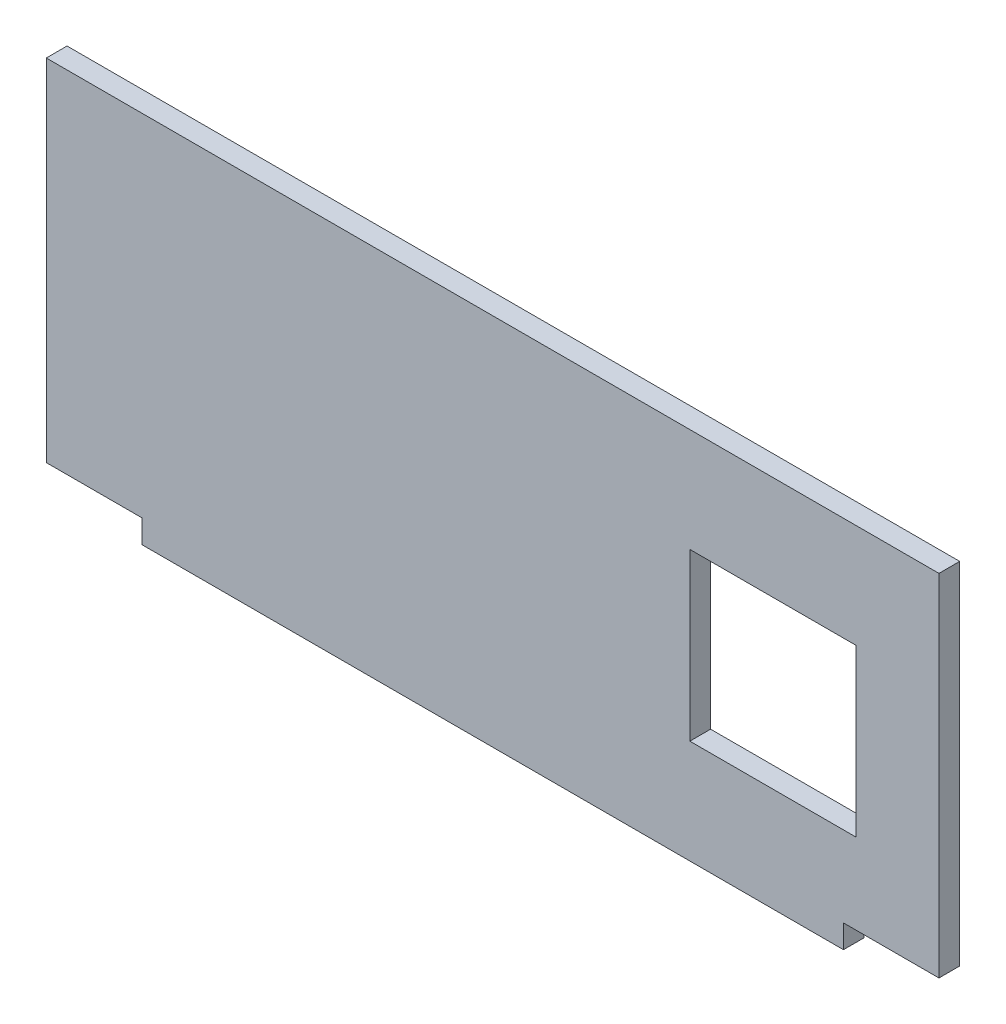
ISO-10303-21;
HEADER;
FILE_DESCRIPTION(('STEP AP214'),'2;1');
FILE_NAME('part.step','',(''),(''),'','','');
FILE_SCHEMA(('AUTOMOTIVE_DESIGN { 1 0 10303 214 1 1 1 1 }'));
ENDSEC;
DATA;
#1=APPLICATION_CONTEXT('core data for automotive mechanical design processes');
#2=APPLICATION_PROTOCOL_DEFINITION('international standard','automotive_design',2000,#1);
#3=PRODUCT_CONTEXT('',#1,'mechanical');
#4=PRODUCT('Part','Part','',(#3));
#5=PRODUCT_RELATED_PRODUCT_CATEGORY('part','',(#4));
#6=PRODUCT_DEFINITION_FORMATION('','',#4);
#7=PRODUCT_DEFINITION_CONTEXT('part definition',#1,'design');
#8=PRODUCT_DEFINITION('design','',#6,#7);
#9=PRODUCT_DEFINITION_SHAPE('','',#8);
#10=(LENGTH_UNIT() NAMED_UNIT(*) SI_UNIT(.MILLI.,.METRE.));
#11=(NAMED_UNIT(*) PLANE_ANGLE_UNIT() SI_UNIT($,.RADIAN.));
#12=(NAMED_UNIT(*) SI_UNIT($,.STERADIAN.) SOLID_ANGLE_UNIT());
#13=UNCERTAINTY_MEASURE_WITH_UNIT(LENGTH_MEASURE(1.E-05),#10,'distance_accuracy_value','');
#14=(GEOMETRIC_REPRESENTATION_CONTEXT(3) GLOBAL_UNCERTAINTY_ASSIGNED_CONTEXT((#13)) GLOBAL_UNIT_ASSIGNED_CONTEXT((#10,
#11,#12)) REPRESENTATION_CONTEXT('',''));
#15=CARTESIAN_POINT('',(0.,0.,0.));
#16=DIRECTION('',(0.,0.,1.));
#17=DIRECTION('',(1.,0.,0.));
#18=AXIS2_PLACEMENT_3D('',#15,#16,#17);
#19=CARTESIAN_POINT('',(0.,0.,10.));
#20=DIRECTION('',(-1.,0.,0.));
#21=DIRECTION('',(0.,-1.,0.));
#22=AXIS2_PLACEMENT_3D('',#19,#20,#21);
#23=PLANE('',#22);
#24=DIRECTION('',(0.,1.,0.));
#25=VECTOR('',#24,1.);
#26=CARTESIAN_POINT('',(0.,0.,10.));
#27=LINE('',#26,#25);
#28=CARTESIAN_POINT('',(0.,11.2,10.));
#29=VERTEX_POINT('',#28);
#30=CARTESIAN_POINT('',(0.,180.,10.));
#31=VERTEX_POINT('',#30);
#32=EDGE_CURVE('E143',#29,#31,#27,.T.);
#33=ORIENTED_EDGE('',*,*,#32,.F.);
#34=DIRECTION('',(0.,0.,1.));
#35=VECTOR('',#34,1.);
#36=CARTESIAN_POINT('',(0.,11.2,0.));
#37=LINE('',#36,#35);
#38=CARTESIAN_POINT('',(0.,11.2,0.));
#39=VERTEX_POINT('',#38);
#40=EDGE_CURVE('E217',#39,#29,#37,.T.);
#41=ORIENTED_EDGE('',*,*,#40,.F.);
#42=DIRECTION('',(0.,1.,0.));
#43=VECTOR('',#42,1.);
#44=CARTESIAN_POINT('',(0.,0.,0.));
#45=LINE('',#44,#43);
#46=CARTESIAN_POINT('',(0.,180.,0.));
#47=VERTEX_POINT('',#46);
#48=EDGE_CURVE('E166',#39,#47,#45,.T.);
#49=ORIENTED_EDGE('',*,*,#48,.T.);
#50=DIRECTION('',(0.,0.,-1.));
#51=VECTOR('',#50,1.);
#52=CARTESIAN_POINT('',(0.,180.,10.));
#53=LINE('',#52,#51);
#54=EDGE_CURVE('E11',#31,#47,#53,.T.);
#55=ORIENTED_EDGE('',*,*,#54,.F.);
#56=EDGE_LOOP('',(#33,#41,#49,#55));
#57=FACE_BOUND('',#56,.T.);
#58=ADVANCED_FACE('F35',(#57),#23,.F.);
#59=CARTESIAN_POINT('',(0.,180.,10.));
#60=DIRECTION('',(0.,-1.,0.));
#61=DIRECTION('',(1.,0.,0.));
#62=AXIS2_PLACEMENT_3D('',#59,#60,#61);
#63=PLANE('',#62);
#64=DIRECTION('',(-1.,0.,0.));
#65=VECTOR('',#64,1.);
#66=CARTESIAN_POINT('',(0.,180.,0.));
#67=LINE('',#66,#65);
#68=CARTESIAN_POINT('',(-430.,180.,0.));
#69=VERTEX_POINT('',#68);
#70=EDGE_CURVE('E149',#47,#69,#67,.T.);
#71=ORIENTED_EDGE('',*,*,#70,.T.);
#72=DIRECTION('',(0.,0.,-1.));
#73=VECTOR('',#72,1.);
#74=CARTESIAN_POINT('',(-430.,180.,10.));
#75=LINE('',#74,#73);
#76=CARTESIAN_POINT('',(-430.,180.,10.));
#77=VERTEX_POINT('',#76);
#78=EDGE_CURVE('E42',#77,#69,#75,.T.);
#79=ORIENTED_EDGE('',*,*,#78,.F.);
#80=DIRECTION('',(-1.,0.,0.));
#81=VECTOR('',#80,1.);
#82=CARTESIAN_POINT('',(0.,180.,10.));
#83=LINE('',#82,#81);
#84=EDGE_CURVE('E146',#31,#77,#83,.T.);
#85=ORIENTED_EDGE('',*,*,#84,.F.);
#86=ORIENTED_EDGE('',*,*,#54,.T.);
#87=EDGE_LOOP('',(#71,#79,#85,#86));
#88=FACE_BOUND('',#87,.T.);
#89=ADVANCED_FACE('F170',(#88),#63,.F.);
#90=CARTESIAN_POINT('',(-430.,0.,10.));
#91=DIRECTION('',(1.,0.,0.));
#92=DIRECTION('',(0.,0.,-1.));
#93=AXIS2_PLACEMENT_3D('',#90,#91,#92);
#94=PLANE('',#93);
#95=DIRECTION('',(0.,-1.,0.));
#96=VECTOR('',#95,1.);
#97=CARTESIAN_POINT('',(-430.,0.,0.));
#98=LINE('',#97,#96);
#99=CARTESIAN_POINT('',(-430.,11.2,0.));
#100=VERTEX_POINT('',#99);
#101=EDGE_CURVE('E144',#69,#100,#98,.T.);
#102=ORIENTED_EDGE('',*,*,#101,.T.);
#103=DIRECTION('',(0.,0.,1.));
#104=VECTOR('',#103,1.);
#105=CARTESIAN_POINT('',(-430.,11.2,0.));
#106=LINE('',#105,#104);
#107=CARTESIAN_POINT('',(-430.,11.2,10.));
#108=VERTEX_POINT('',#107);
#109=EDGE_CURVE('E176',#100,#108,#106,.T.);
#110=ORIENTED_EDGE('',*,*,#109,.T.);
#111=DIRECTION('',(0.,-1.,0.));
#112=VECTOR('',#111,1.);
#113=CARTESIAN_POINT('',(-430.,0.,10.));
#114=LINE('',#113,#112);
#115=EDGE_CURVE('E157',#77,#108,#114,.T.);
#116=ORIENTED_EDGE('',*,*,#115,.F.);
#117=ORIENTED_EDGE('',*,*,#78,.T.);
#118=EDGE_LOOP('',(#102,#110,#116,#117));
#119=FACE_BOUND('',#118,.T.);
#120=ADVANCED_FACE('F175',(#119),#94,.F.);
#121=CARTESIAN_POINT('',(0.,0.,10.));
#122=DIRECTION('',(0.,1.,0.));
#123=DIRECTION('',(0.,0.,1.));
#124=AXIS2_PLACEMENT_3D('',#121,#122,#123);
#125=PLANE('',#124);
#126=DIRECTION('',(1.,0.,0.));
#127=VECTOR('',#126,1.);
#128=CARTESIAN_POINT('',(0.,0.,10.));
#129=LINE('',#128,#127);
#130=CARTESIAN_POINT('',(-384.,0.,10.));
#131=VERTEX_POINT('',#130);
#132=CARTESIAN_POINT('',(-46.,0.,10.));
#133=VERTEX_POINT('',#132);
#134=EDGE_CURVE('E139',#131,#133,#129,.T.);
#135=ORIENTED_EDGE('',*,*,#134,.F.);
#136=DIRECTION('',(0.,0.,1.));
#137=VECTOR('',#136,1.);
#138=CARTESIAN_POINT('',(-384.,0.,0.));
#139=LINE('',#138,#137);
#140=CARTESIAN_POINT('',(-384.,0.,0.));
#141=VERTEX_POINT('',#140);
#142=EDGE_CURVE('E127',#141,#131,#139,.T.);
#143=ORIENTED_EDGE('',*,*,#142,.F.);
#144=DIRECTION('',(1.,0.,0.));
#145=VECTOR('',#144,1.);
#146=CARTESIAN_POINT('',(0.,0.,0.));
#147=LINE('',#146,#145);
#148=CARTESIAN_POINT('',(-46.,0.,0.));
#149=VERTEX_POINT('',#148);
#150=EDGE_CURVE('E138',#141,#149,#147,.T.);
#151=ORIENTED_EDGE('',*,*,#150,.T.);
#152=DIRECTION('',(0.,0.,1.));
#153=VECTOR('',#152,1.);
#154=CARTESIAN_POINT('',(-46.,0.,0.));
#155=LINE('',#154,#153);
#156=EDGE_CURVE('E206',#149,#133,#155,.T.);
#157=ORIENTED_EDGE('',*,*,#156,.T.);
#158=EDGE_LOOP('',(#135,#143,#151,#157));
#159=FACE_BOUND('',#158,.T.);
#160=ADVANCED_FACE('F136',(#159),#125,.F.);
#161=CARTESIAN_POINT('',(0.,0.,10.));
#162=DIRECTION('',(0.,0.,1.));
#163=DIRECTION('',(1.,0.,0.));
#164=AXIS2_PLACEMENT_3D('',#161,#162,#163);
#165=PLANE('',#164);
#166=DIRECTION('',(-1.,0.,0.));
#167=VECTOR('',#166,1.);
#168=CARTESIAN_POINT('',(-430.,11.2,10.));
#169=LINE('',#168,#167);
#170=CARTESIAN_POINT('',(-384.,11.2,10.));
#171=VERTEX_POINT('',#170);
#172=EDGE_CURVE('E132',#171,#108,#169,.T.);
#173=ORIENTED_EDGE('',*,*,#172,.F.);
#174=DIRECTION('',(0.,1.,0.));
#175=VECTOR('',#174,1.);
#176=CARTESIAN_POINT('',(-384.,0.,10.));
#177=LINE('',#176,#175);
#178=EDGE_CURVE('E231',#131,#171,#177,.T.);
#179=ORIENTED_EDGE('',*,*,#178,.F.);
#180=ORIENTED_EDGE('',*,*,#134,.T.);
#181=DIRECTION('',(0.,-1.,0.));
#182=VECTOR('',#181,1.);
#183=CARTESIAN_POINT('',(-46.,0.,10.));
#184=LINE('',#183,#182);
#185=CARTESIAN_POINT('',(-46.,11.2,10.));
#186=VERTEX_POINT('',#185);
#187=EDGE_CURVE('E222',#186,#133,#184,.T.);
#188=ORIENTED_EDGE('',*,*,#187,.F.);
#189=DIRECTION('',(-1.,0.,0.));
#190=VECTOR('',#189,1.);
#191=CARTESIAN_POINT('',(0.,11.2,10.));
#192=LINE('',#191,#190);
#193=EDGE_CURVE('E177',#29,#186,#192,.T.);
#194=ORIENTED_EDGE('',*,*,#193,.F.);
#195=ORIENTED_EDGE('',*,*,#32,.T.);
#196=ORIENTED_EDGE('',*,*,#84,.T.);
#197=ORIENTED_EDGE('',*,*,#115,.T.);
#198=EDGE_LOOP('',(#173,#179,#180,#188,#194,#195,#196,#197));
#199=FACE_BOUND('',#198,.T.);
#200=DIRECTION('',(0.,-1.,0.));
#201=VECTOR('',#200,1.);
#202=CARTESIAN_POINT('',(-40.,130.,10.));
#203=LINE('',#202,#201);
#204=CARTESIAN_POINT('',(-40.,130.,10.));
#205=VERTEX_POINT('',#204);
#206=CARTESIAN_POINT('',(-40.,50.,10.));
#207=VERTEX_POINT('',#206);
#208=EDGE_CURVE('E197',#205,#207,#203,.T.);
#209=ORIENTED_EDGE('',*,*,#208,.T.);
#210=DIRECTION('',(-1.,0.,0.));
#211=VECTOR('',#210,1.);
#212=CARTESIAN_POINT('',(-40.,50.,10.));
#213=LINE('',#212,#211);
#214=CARTESIAN_POINT('',(-120.,50.,10.));
#215=VERTEX_POINT('',#214);
#216=EDGE_CURVE('E212',#207,#215,#213,.T.);
#217=ORIENTED_EDGE('',*,*,#216,.T.);
#218=DIRECTION('',(0.,1.,0.));
#219=VECTOR('',#218,1.);
#220=CARTESIAN_POINT('',(-120.,130.,10.));
#221=LINE('',#220,#219);
#222=CARTESIAN_POINT('',(-120.,130.,10.));
#223=VERTEX_POINT('',#222);
#224=EDGE_CURVE('E209',#215,#223,#221,.T.);
#225=ORIENTED_EDGE('',*,*,#224,.T.);
#226=DIRECTION('',(1.,0.,0.));
#227=VECTOR('',#226,1.);
#228=CARTESIAN_POINT('',(-40.,130.,10.));
#229=LINE('',#228,#227);
#230=EDGE_CURVE('E189',#223,#205,#229,.T.);
#231=ORIENTED_EDGE('',*,*,#230,.T.);
#232=EDGE_LOOP('',(#209,#217,#225,#231));
#233=FACE_BOUND('',#232,.T.);
#234=ADVANCED_FACE('F180',(#199,#233),#165,.T.);
#235=CARTESIAN_POINT('',(0.,0.,0.));
#236=DIRECTION('',(0.,0.,1.));
#237=DIRECTION('',(1.,0.,0.));
#238=AXIS2_PLACEMENT_3D('',#235,#236,#237);
#239=PLANE('',#238);
#240=DIRECTION('',(-1.,0.,0.));
#241=VECTOR('',#240,1.);
#242=CARTESIAN_POINT('',(-40.,50.,0.));
#243=LINE('',#242,#241);
#244=CARTESIAN_POINT('',(-40.,50.,0.));
#245=VERTEX_POINT('',#244);
#246=CARTESIAN_POINT('',(-120.,50.,0.));
#247=VERTEX_POINT('',#246);
#248=EDGE_CURVE('E201',#245,#247,#243,.T.);
#249=ORIENTED_EDGE('',*,*,#248,.F.);
#250=DIRECTION('',(0.,-1.,0.));
#251=VECTOR('',#250,1.);
#252=CARTESIAN_POINT('',(-40.,130.,0.));
#253=LINE('',#252,#251);
#254=CARTESIAN_POINT('',(-40.,130.,0.));
#255=VERTEX_POINT('',#254);
#256=EDGE_CURVE('E204',#255,#245,#253,.T.);
#257=ORIENTED_EDGE('',*,*,#256,.F.);
#258=DIRECTION('',(1.,0.,0.));
#259=VECTOR('',#258,1.);
#260=CARTESIAN_POINT('',(-40.,130.,0.));
#261=LINE('',#260,#259);
#262=CARTESIAN_POINT('',(-120.,130.,0.));
#263=VERTEX_POINT('',#262);
#264=EDGE_CURVE('E194',#263,#255,#261,.T.);
#265=ORIENTED_EDGE('',*,*,#264,.F.);
#266=DIRECTION('',(0.,1.,0.));
#267=VECTOR('',#266,1.);
#268=CARTESIAN_POINT('',(-120.,130.,0.));
#269=LINE('',#268,#267);
#270=EDGE_CURVE('E198',#247,#263,#269,.T.);
#271=ORIENTED_EDGE('',*,*,#270,.F.);
#272=EDGE_LOOP('',(#249,#257,#265,#271));
#273=FACE_BOUND('',#272,.T.);
#274=DIRECTION('',(0.,1.,0.));
#275=VECTOR('',#274,1.);
#276=CARTESIAN_POINT('',(-384.,0.,0.));
#277=LINE('',#276,#275);
#278=CARTESIAN_POINT('',(-384.,11.2,0.));
#279=VERTEX_POINT('',#278);
#280=EDGE_CURVE('E123',#141,#279,#277,.T.);
#281=ORIENTED_EDGE('',*,*,#280,.T.);
#282=DIRECTION('',(-1.,0.,0.));
#283=VECTOR('',#282,1.);
#284=CARTESIAN_POINT('',(-430.,11.2,0.));
#285=LINE('',#284,#283);
#286=EDGE_CURVE('E49',#279,#100,#285,.T.);
#287=ORIENTED_EDGE('',*,*,#286,.T.);
#288=ORIENTED_EDGE('',*,*,#101,.F.);
#289=ORIENTED_EDGE('',*,*,#70,.F.);
#290=ORIENTED_EDGE('',*,*,#48,.F.);
#291=DIRECTION('',(-1.,0.,0.));
#292=VECTOR('',#291,1.);
#293=CARTESIAN_POINT('',(0.,11.2,0.));
#294=LINE('',#293,#292);
#295=CARTESIAN_POINT('',(-46.,11.2,0.));
#296=VERTEX_POINT('',#295);
#297=EDGE_CURVE('E224',#39,#296,#294,.T.);
#298=ORIENTED_EDGE('',*,*,#297,.T.);
#299=DIRECTION('',(0.,-1.,0.));
#300=VECTOR('',#299,1.);
#301=CARTESIAN_POINT('',(-46.,0.,0.));
#302=LINE('',#301,#300);
#303=EDGE_CURVE('E57',#296,#149,#302,.T.);
#304=ORIENTED_EDGE('',*,*,#303,.T.);
#305=ORIENTED_EDGE('',*,*,#150,.F.);
#306=EDGE_LOOP('',(#281,#287,#288,#289,#290,#298,#304,#305));
#307=FACE_BOUND('',#306,.T.);
#308=ADVANCED_FACE('F141',(#273,#307),#239,.F.);
#309=CARTESIAN_POINT('',(-40.,130.,10.));
#310=DIRECTION('',(1.,0.,0.));
#311=DIRECTION('',(0.,1.,0.));
#312=AXIS2_PLACEMENT_3D('',#309,#310,#311);
#313=PLANE('',#312);
#314=ORIENTED_EDGE('',*,*,#256,.T.);
#315=DIRECTION('',(0.,0.,-1.));
#316=VECTOR('',#315,1.);
#317=CARTESIAN_POINT('',(-40.,50.,10.));
#318=LINE('',#317,#316);
#319=EDGE_CURVE('E185',#207,#245,#318,.T.);
#320=ORIENTED_EDGE('',*,*,#319,.F.);
#321=ORIENTED_EDGE('',*,*,#208,.F.);
#322=DIRECTION('',(0.,0.,-1.));
#323=VECTOR('',#322,1.);
#324=CARTESIAN_POINT('',(-40.,130.,10.));
#325=LINE('',#324,#323);
#326=EDGE_CURVE('E167',#205,#255,#325,.T.);
#327=ORIENTED_EDGE('',*,*,#326,.T.);
#328=EDGE_LOOP('',(#314,#320,#321,#327));
#329=FACE_BOUND('',#328,.T.);
#330=ADVANCED_FACE('F264',(#329),#313,.F.);
#331=CARTESIAN_POINT('',(-40.,130.,10.));
#332=DIRECTION('',(0.,1.,0.));
#333=DIRECTION('',(0.,0.,1.));
#334=AXIS2_PLACEMENT_3D('',#331,#332,#333);
#335=PLANE('',#334);
#336=ORIENTED_EDGE('',*,*,#264,.T.);
#337=ORIENTED_EDGE('',*,*,#326,.F.);
#338=ORIENTED_EDGE('',*,*,#230,.F.);
#339=DIRECTION('',(0.,0.,-1.));
#340=VECTOR('',#339,1.);
#341=CARTESIAN_POINT('',(-120.,130.,10.));
#342=LINE('',#341,#340);
#343=EDGE_CURVE('E191',#223,#263,#342,.T.);
#344=ORIENTED_EDGE('',*,*,#343,.T.);
#345=EDGE_LOOP('',(#336,#337,#338,#344));
#346=FACE_BOUND('',#345,.T.);
#347=ADVANCED_FACE('F261',(#346),#335,.F.);
#348=CARTESIAN_POINT('',(-120.,130.,10.));
#349=DIRECTION('',(-1.,0.,0.));
#350=DIRECTION('',(0.,-1.,0.));
#351=AXIS2_PLACEMENT_3D('',#348,#349,#350);
#352=PLANE('',#351);
#353=ORIENTED_EDGE('',*,*,#270,.T.);
#354=ORIENTED_EDGE('',*,*,#343,.F.);
#355=ORIENTED_EDGE('',*,*,#224,.F.);
#356=DIRECTION('',(0.,0.,-1.));
#357=VECTOR('',#356,1.);
#358=CARTESIAN_POINT('',(-120.,50.,10.));
#359=LINE('',#358,#357);
#360=EDGE_CURVE('E188',#215,#247,#359,.T.);
#361=ORIENTED_EDGE('',*,*,#360,.T.);
#362=EDGE_LOOP('',(#353,#354,#355,#361));
#363=FACE_BOUND('',#362,.T.);
#364=ADVANCED_FACE('F257',(#363),#352,.F.);
#365=CARTESIAN_POINT('',(-40.,50.,10.));
#366=DIRECTION('',(0.,-1.,0.));
#367=DIRECTION('',(0.,0.,-1.));
#368=AXIS2_PLACEMENT_3D('',#365,#366,#367);
#369=PLANE('',#368);
#370=ORIENTED_EDGE('',*,*,#248,.T.);
#371=ORIENTED_EDGE('',*,*,#360,.F.);
#372=ORIENTED_EDGE('',*,*,#216,.F.);
#373=ORIENTED_EDGE('',*,*,#319,.T.);
#374=EDGE_LOOP('',(#370,#371,#372,#373));
#375=FACE_BOUND('',#374,.T.);
#376=ADVANCED_FACE('F252',(#375),#369,.F.);
#377=CARTESIAN_POINT('',(-46.,0.,0.));
#378=DIRECTION('',(-1.,0.,0.));
#379=DIRECTION('',(0.,0.,1.));
#380=AXIS2_PLACEMENT_3D('',#377,#378,#379);
#381=PLANE('',#380);
#382=ORIENTED_EDGE('',*,*,#187,.T.);
#383=ORIENTED_EDGE('',*,*,#156,.F.);
#384=ORIENTED_EDGE('',*,*,#303,.F.);
#385=DIRECTION('',(0.,0.,1.));
#386=VECTOR('',#385,1.);
#387=CARTESIAN_POINT('',(-46.,11.2,0.));
#388=LINE('',#387,#386);
#389=EDGE_CURVE('E219',#296,#186,#388,.T.);
#390=ORIENTED_EDGE('',*,*,#389,.T.);
#391=EDGE_LOOP('',(#382,#383,#384,#390));
#392=FACE_BOUND('',#391,.T.);
#393=ADVANCED_FACE('F242',(#392),#381,.F.);
#394=CARTESIAN_POINT('',(0.,11.2,0.));
#395=DIRECTION('',(0.,1.,0.));
#396=DIRECTION('',(-1.,0.,0.));
#397=AXIS2_PLACEMENT_3D('',#394,#395,#396);
#398=PLANE('',#397);
#399=ORIENTED_EDGE('',*,*,#193,.T.);
#400=ORIENTED_EDGE('',*,*,#389,.F.);
#401=ORIENTED_EDGE('',*,*,#297,.F.);
#402=ORIENTED_EDGE('',*,*,#40,.T.);
#403=EDGE_LOOP('',(#399,#400,#401,#402));
#404=FACE_BOUND('',#403,.T.);
#405=ADVANCED_FACE('F235',(#404),#398,.F.);
#406=CARTESIAN_POINT('',(-430.,11.2,0.));
#407=DIRECTION('',(0.,1.,0.));
#408=DIRECTION('',(0.,0.,1.));
#409=AXIS2_PLACEMENT_3D('',#406,#407,#408);
#410=PLANE('',#409);
#411=ORIENTED_EDGE('',*,*,#172,.T.);
#412=ORIENTED_EDGE('',*,*,#109,.F.);
#413=ORIENTED_EDGE('',*,*,#286,.F.);
#414=DIRECTION('',(0.,0.,1.));
#415=VECTOR('',#414,1.);
#416=CARTESIAN_POINT('',(-384.,11.2,0.));
#417=LINE('',#416,#415);
#418=EDGE_CURVE('E129',#279,#171,#417,.T.);
#419=ORIENTED_EDGE('',*,*,#418,.T.);
#420=EDGE_LOOP('',(#411,#412,#413,#419));
#421=FACE_BOUND('',#420,.T.);
#422=ADVANCED_FACE('F233',(#421),#410,.F.);
#423=CARTESIAN_POINT('',(-384.,0.,0.));
#424=DIRECTION('',(1.,0.,0.));
#425=DIRECTION('',(0.,0.,-1.));
#426=AXIS2_PLACEMENT_3D('',#423,#424,#425);
#427=PLANE('',#426);
#428=ORIENTED_EDGE('',*,*,#178,.T.);
#429=ORIENTED_EDGE('',*,*,#418,.F.);
#430=ORIENTED_EDGE('',*,*,#280,.F.);
#431=ORIENTED_EDGE('',*,*,#142,.T.);
#432=EDGE_LOOP('',(#428,#429,#430,#431));
#433=FACE_BOUND('',#432,.T.);
#434=ADVANCED_FACE('F126',(#433),#427,.F.);
#435=CLOSED_SHELL('',(#58,#89,#120,#160,#234,#308,#330,#347,#364,#376,#393,#405,#422,#434));
#436=MANIFOLD_SOLID_BREP('B2',#435);
#437=ADVANCED_BREP_SHAPE_REPRESENTATION('',(#18,#436),#14);
#438=SHAPE_DEFINITION_REPRESENTATION(#9,#437);
ENDSEC;
END-ISO-10303-21;
